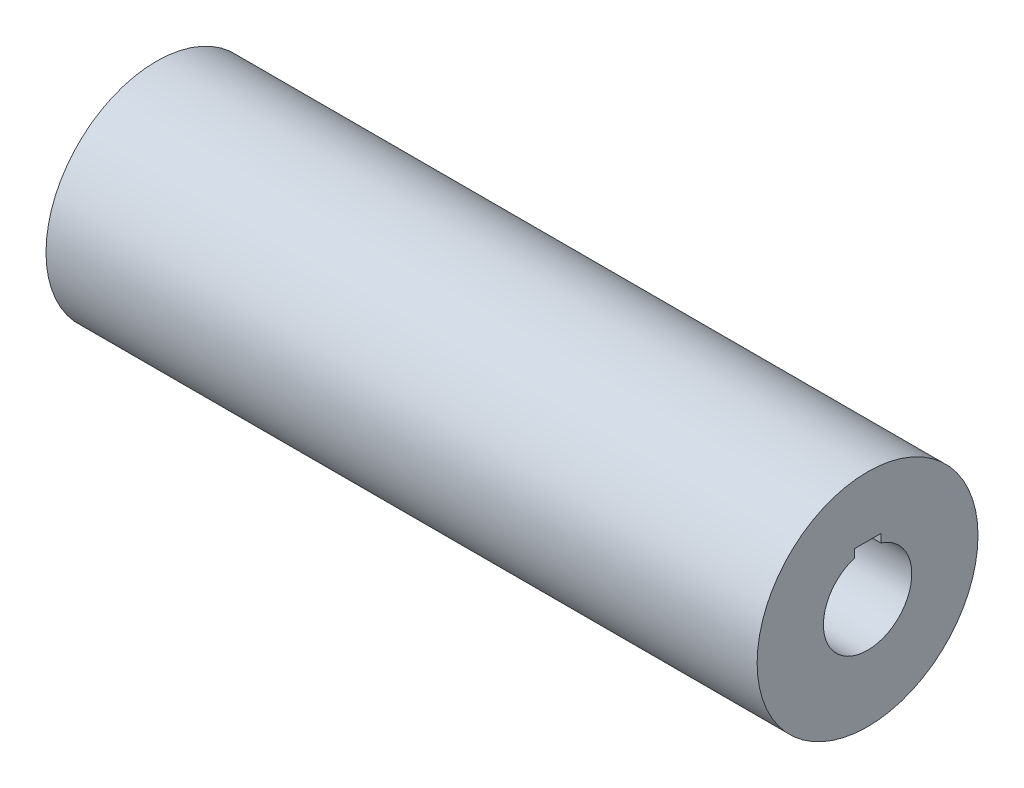
ISO-10303-21;
HEADER;
FILE_DESCRIPTION(('STEP AP214'),'2;1');
FILE_NAME('part.step','',(''),(''),'','','');
FILE_SCHEMA(('AUTOMOTIVE_DESIGN { 1 0 10303 214 1 1 1 1 }'));
ENDSEC;
DATA;
#1=APPLICATION_CONTEXT('core data for automotive mechanical design processes');
#2=APPLICATION_PROTOCOL_DEFINITION('international standard','automotive_design',2000,#1);
#3=PRODUCT_CONTEXT('',#1,'mechanical');
#4=PRODUCT('Part','Part','',(#3));
#5=PRODUCT_RELATED_PRODUCT_CATEGORY('part','',(#4));
#6=PRODUCT_DEFINITION_FORMATION('','',#4);
#7=PRODUCT_DEFINITION_CONTEXT('part definition',#1,'design');
#8=PRODUCT_DEFINITION('design','',#6,#7);
#9=PRODUCT_DEFINITION_SHAPE('','',#8);
#10=(LENGTH_UNIT() NAMED_UNIT(*) SI_UNIT(.MILLI.,.METRE.));
#11=(NAMED_UNIT(*) PLANE_ANGLE_UNIT() SI_UNIT($,.RADIAN.));
#12=(NAMED_UNIT(*) SI_UNIT($,.STERADIAN.) SOLID_ANGLE_UNIT());
#13=UNCERTAINTY_MEASURE_WITH_UNIT(LENGTH_MEASURE(1.E-05),#10,'distance_accuracy_value','');
#14=(GEOMETRIC_REPRESENTATION_CONTEXT(3) GLOBAL_UNCERTAINTY_ASSIGNED_CONTEXT((#13)) GLOBAL_UNIT_ASSIGNED_CONTEXT((#10,
#11,#12)) REPRESENTATION_CONTEXT('',''));
#15=CARTESIAN_POINT('',(0.,0.,0.));
#16=DIRECTION('',(0.,0.,1.));
#17=DIRECTION('',(1.,0.,0.));
#18=AXIS2_PLACEMENT_3D('',#15,#16,#17);
#19=CARTESIAN_POINT('',(80.5,0.,0.));
#20=DIRECTION('',(1.,0.,0.));
#21=DIRECTION('',(0.,0.,-1.));
#22=AXIS2_PLACEMENT_3D('',#19,#20,#21);
#23=PLANE('',#22);
#24=DIRECTION('',(0.,1.,0.));
#25=VECTOR('',#24,1.);
#26=CARTESIAN_POINT('',(80.5,8.6,-3.));
#27=LINE('',#26,#25);
#28=CARTESIAN_POINT('',(80.5,9.53939201416946,-3.));
#29=VERTEX_POINT('',#28);
#30=CARTESIAN_POINT('',(80.5,11.4,-3.));
#31=VERTEX_POINT('',#30);
#32=EDGE_CURVE('E84',#29,#31,#27,.T.);
#33=ORIENTED_EDGE('',*,*,#32,.F.);
#34=CARTESIAN_POINT('',(80.5,0.,0.));
#35=DIRECTION('',(1.,0.,0.));
#36=DIRECTION('',(0.,0.,-1.));
#37=AXIS2_PLACEMENT_3D('',#34,#35,#36);
#38=CIRCLE('',#37,10.);
#39=CARTESIAN_POINT('',(80.5,9.53939201416946,3.));
#40=VERTEX_POINT('',#39);
#41=EDGE_CURVE('E117',#40,#29,#38,.T.);
#42=ORIENTED_EDGE('',*,*,#41,.F.);
#43=DIRECTION('',(0.,-1.,0.));
#44=VECTOR('',#43,1.);
#45=CARTESIAN_POINT('',(80.5,8.6,3.));
#46=LINE('',#45,#44);
#47=CARTESIAN_POINT('',(80.5,11.4,3.));
#48=VERTEX_POINT('',#47);
#49=EDGE_CURVE('E55',#48,#40,#46,.T.);
#50=ORIENTED_EDGE('',*,*,#49,.F.);
#51=DIRECTION('',(0.,0.,1.));
#52=VECTOR('',#51,1.);
#53=CARTESIAN_POINT('',(80.5,11.4,3.));
#54=LINE('',#53,#52);
#55=EDGE_CURVE('E106',#31,#48,#54,.T.);
#56=ORIENTED_EDGE('',*,*,#55,.F.);
#57=EDGE_LOOP('',(#33,#42,#50,#56));
#58=FACE_BOUND('',#57,.T.);
#59=CARTESIAN_POINT('',(80.5,0.,0.));
#60=DIRECTION('',(1.,0.,0.));
#61=DIRECTION('',(0.,0.,-1.));
#62=AXIS2_PLACEMENT_3D('',#59,#60,#61);
#63=CIRCLE('',#62,25.);
#64=CARTESIAN_POINT('',(80.5,0.,-25.));
#65=VERTEX_POINT('',#64);
#66=EDGE_CURVE('E124',#65,#65,#63,.T.);
#67=ORIENTED_EDGE('',*,*,#66,.T.);
#68=EDGE_LOOP('',(#67));
#69=FACE_BOUND('',#68,.T.);
#70=ADVANCED_FACE('F39',(#58,#69),#23,.T.);
#71=CARTESIAN_POINT('',(-80.5,0.,0.));
#72=DIRECTION('',(1.,0.,0.));
#73=DIRECTION('',(0.,0.,-1.));
#74=AXIS2_PLACEMENT_3D('',#71,#72,#73);
#75=PLANE('',#74);
#76=CARTESIAN_POINT('',(-80.5,0.,0.));
#77=DIRECTION('',(1.,0.,0.));
#78=DIRECTION('',(0.,0.,-1.));
#79=AXIS2_PLACEMENT_3D('',#76,#77,#78);
#80=CIRCLE('',#79,10.);
#81=CARTESIAN_POINT('',(-80.5,9.53939201416946,3.));
#82=VERTEX_POINT('',#81);
#83=CARTESIAN_POINT('',(-80.5,9.53939201416946,-3.));
#84=VERTEX_POINT('',#83);
#85=EDGE_CURVE('E102',#82,#84,#80,.T.);
#86=ORIENTED_EDGE('',*,*,#85,.T.);
#87=DIRECTION('',(0.,1.,0.));
#88=VECTOR('',#87,1.);
#89=CARTESIAN_POINT('',(-80.5,8.6,-3.));
#90=LINE('',#89,#88);
#91=CARTESIAN_POINT('',(-80.5,11.4,-3.));
#92=VERTEX_POINT('',#91);
#93=EDGE_CURVE('E81',#84,#92,#90,.T.);
#94=ORIENTED_EDGE('',*,*,#93,.T.);
#95=DIRECTION('',(0.,0.,1.));
#96=VECTOR('',#95,1.);
#97=CARTESIAN_POINT('',(-80.5,11.4,3.));
#98=LINE('',#97,#96);
#99=CARTESIAN_POINT('',(-80.5,11.4,3.));
#100=VERTEX_POINT('',#99);
#101=EDGE_CURVE('E93',#92,#100,#98,.T.);
#102=ORIENTED_EDGE('',*,*,#101,.T.);
#103=DIRECTION('',(0.,-1.,0.));
#104=VECTOR('',#103,1.);
#105=CARTESIAN_POINT('',(-80.5,8.6,3.));
#106=LINE('',#105,#104);
#107=EDGE_CURVE('E90',#100,#82,#106,.T.);
#108=ORIENTED_EDGE('',*,*,#107,.T.);
#109=EDGE_LOOP('',(#86,#94,#102,#108));
#110=FACE_BOUND('',#109,.T.);
#111=CARTESIAN_POINT('',(-80.5,0.,0.));
#112=DIRECTION('',(1.,0.,0.));
#113=DIRECTION('',(0.,0.,-1.));
#114=AXIS2_PLACEMENT_3D('',#111,#112,#113);
#115=CIRCLE('',#114,25.);
#116=CARTESIAN_POINT('',(-80.5,0.,-25.));
#117=VERTEX_POINT('',#116);
#118=EDGE_CURVE('E121',#117,#117,#115,.T.);
#119=ORIENTED_EDGE('',*,*,#118,.F.);
#120=EDGE_LOOP('',(#119));
#121=FACE_BOUND('',#120,.T.);
#122=ADVANCED_FACE('F99',(#110,#121),#75,.F.);
#123=CARTESIAN_POINT('',(80.5,0.,0.));
#124=DIRECTION('',(-1.,0.,0.));
#125=DIRECTION('',(0.,0.,1.));
#126=AXIS2_PLACEMENT_3D('',#123,#124,#125);
#127=CYLINDRICAL_SURFACE('',#126,25.);
#128=ORIENTED_EDGE('',*,*,#66,.F.);
#129=EDGE_LOOP('',(#128));
#130=FACE_BOUND('',#129,.T.);
#131=ORIENTED_EDGE('',*,*,#118,.T.);
#132=EDGE_LOOP('',(#131));
#133=FACE_BOUND('',#132,.T.);
#134=ADVANCED_FACE('F41',(#130,#133),#127,.T.);
#135=CARTESIAN_POINT('',(80.5,0.,0.));
#136=DIRECTION('',(-1.,0.,0.));
#137=DIRECTION('',(0.,0.,1.));
#138=AXIS2_PLACEMENT_3D('',#135,#136,#137);
#139=CYLINDRICAL_SURFACE('',#138,10.);
#140=DIRECTION('',(-1.,0.,0.));
#141=VECTOR('',#140,1.);
#142=CARTESIAN_POINT('',(80.5,9.53939201416946,-3.));
#143=LINE('',#142,#141);
#144=EDGE_CURVE('E11',#84,#29,#143,.F.);
#145=ORIENTED_EDGE('',*,*,#144,.F.);
#146=ORIENTED_EDGE('',*,*,#85,.F.);
#147=DIRECTION('',(-1.,0.,0.));
#148=VECTOR('',#147,1.);
#149=CARTESIAN_POINT('',(80.5,9.53939201416946,3.));
#150=LINE('',#149,#148);
#151=EDGE_CURVE('E48',#40,#82,#150,.T.);
#152=ORIENTED_EDGE('',*,*,#151,.F.);
#153=ORIENTED_EDGE('',*,*,#41,.T.);
#154=EDGE_LOOP('',(#145,#146,#152,#153));
#155=FACE_BOUND('',#154,.T.);
#156=ADVANCED_FACE('F138',(#155),#139,.F.);
#157=CARTESIAN_POINT('',(-80.5,8.6,-3.));
#158=DIRECTION('',(0.,0.,-1.));
#159=DIRECTION('',(-1.,0.,0.));
#160=AXIS2_PLACEMENT_3D('',#157,#158,#159);
#161=PLANE('',#160);
#162=ORIENTED_EDGE('',*,*,#144,.T.);
#163=ORIENTED_EDGE('',*,*,#32,.T.);
#164=DIRECTION('',(1.,0.,0.));
#165=VECTOR('',#164,1.);
#166=CARTESIAN_POINT('',(-80.5,11.4,-3.));
#167=LINE('',#166,#165);
#168=EDGE_CURVE('E77',#92,#31,#167,.T.);
#169=ORIENTED_EDGE('',*,*,#168,.F.);
#170=ORIENTED_EDGE('',*,*,#93,.F.);
#171=EDGE_LOOP('',(#162,#163,#169,#170));
#172=FACE_BOUND('',#171,.T.);
#173=ADVANCED_FACE('F79',(#172),#161,.F.);
#174=CARTESIAN_POINT('',(-80.5,8.6,3.));
#175=DIRECTION('',(0.,0.,1.));
#176=DIRECTION('',(1.,0.,0.));
#177=AXIS2_PLACEMENT_3D('',#174,#175,#176);
#178=PLANE('',#177);
#179=ORIENTED_EDGE('',*,*,#151,.T.);
#180=ORIENTED_EDGE('',*,*,#107,.F.);
#181=DIRECTION('',(1.,0.,0.));
#182=VECTOR('',#181,1.);
#183=CARTESIAN_POINT('',(-80.5,11.4,3.));
#184=LINE('',#183,#182);
#185=EDGE_CURVE('E89',#100,#48,#184,.T.);
#186=ORIENTED_EDGE('',*,*,#185,.T.);
#187=ORIENTED_EDGE('',*,*,#49,.T.);
#188=EDGE_LOOP('',(#179,#180,#186,#187));
#189=FACE_BOUND('',#188,.T.);
#190=ADVANCED_FACE('F148',(#189),#178,.F.);
#191=CARTESIAN_POINT('',(-80.5,11.4,3.));
#192=DIRECTION('',(0.,1.,0.));
#193=DIRECTION('',(0.,0.,1.));
#194=AXIS2_PLACEMENT_3D('',#191,#192,#193);
#195=PLANE('',#194);
#196=ORIENTED_EDGE('',*,*,#55,.T.);
#197=ORIENTED_EDGE('',*,*,#185,.F.);
#198=ORIENTED_EDGE('',*,*,#101,.F.);
#199=ORIENTED_EDGE('',*,*,#168,.T.);
#200=EDGE_LOOP('',(#196,#197,#198,#199));
#201=FACE_BOUND('',#200,.T.);
#202=ADVANCED_FACE('F94',(#201),#195,.F.);
#203=CLOSED_SHELL('',(#70,#122,#134,#156,#173,#190,#202));
#204=MANIFOLD_SOLID_BREP('B2',#203);
#205=ADVANCED_BREP_SHAPE_REPRESENTATION('',(#18,#204),#14);
#206=SHAPE_DEFINITION_REPRESENTATION(#9,#205);
ENDSEC;
END-ISO-10303-21;
